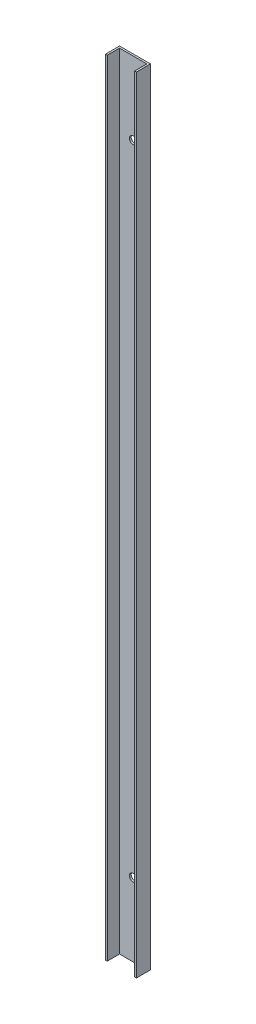
ISO-10303-21;
HEADER;
FILE_DESCRIPTION(('STEP AP214'),'2;1');
FILE_NAME('part.step','',(''),(''),'','','');
FILE_SCHEMA(('AUTOMOTIVE_DESIGN { 1 0 10303 214 1 1 1 1 }'));
ENDSEC;
DATA;
#1=APPLICATION_CONTEXT('core data for automotive mechanical design processes');
#2=APPLICATION_PROTOCOL_DEFINITION('international standard','automotive_design',2000,#1);
#3=PRODUCT_CONTEXT('',#1,'mechanical');
#4=PRODUCT('Part','Part','',(#3));
#5=PRODUCT_RELATED_PRODUCT_CATEGORY('part','',(#4));
#6=PRODUCT_DEFINITION_FORMATION('','',#4);
#7=PRODUCT_DEFINITION_CONTEXT('part definition',#1,'design');
#8=PRODUCT_DEFINITION('design','',#6,#7);
#9=PRODUCT_DEFINITION_SHAPE('','',#8);
#10=(LENGTH_UNIT() NAMED_UNIT(*) SI_UNIT(.MILLI.,.METRE.));
#11=(NAMED_UNIT(*) PLANE_ANGLE_UNIT() SI_UNIT($,.RADIAN.));
#12=(NAMED_UNIT(*) SI_UNIT($,.STERADIAN.) SOLID_ANGLE_UNIT());
#13=UNCERTAINTY_MEASURE_WITH_UNIT(LENGTH_MEASURE(1.E-05),#10,'distance_accuracy_value','');
#14=(GEOMETRIC_REPRESENTATION_CONTEXT(3) GLOBAL_UNCERTAINTY_ASSIGNED_CONTEXT((#13)) GLOBAL_UNIT_ASSIGNED_CONTEXT((#10,
#11,#12)) REPRESENTATION_CONTEXT('',''));
#15=CARTESIAN_POINT('',(0.,0.,0.));
#16=DIRECTION('',(0.,0.,1.));
#17=DIRECTION('',(1.,0.,0.));
#18=AXIS2_PLACEMENT_3D('',#15,#16,#17);
#19=CARTESIAN_POINT('',(5.05454545454545,430.,-7.7));
#20=DIRECTION('',(1.,0.,0.));
#21=DIRECTION('',(0.,0.,-1.));
#22=AXIS2_PLACEMENT_3D('',#19,#20,#21);
#23=PLANE('',#22);
#24=DIRECTION('',(0.,0.,1.));
#25=VECTOR('',#24,1.);
#26=CARTESIAN_POINT('',(5.05454545454545,0.,-7.7));
#27=LINE('',#26,#25);
#28=CARTESIAN_POINT('',(5.05454545454545,0.,-6.7));
#29=VERTEX_POINT('',#28);
#30=CARTESIAN_POINT('',(5.05454545454545,0.,0.));
#31=VERTEX_POINT('',#30);
#32=EDGE_CURVE('E130',#29,#31,#27,.T.);
#33=ORIENTED_EDGE('',*,*,#32,.T.);
#34=DIRECTION('',(0.,-1.,0.));
#35=VECTOR('',#34,1.);
#36=CARTESIAN_POINT('',(5.05454545454545,430.,0.));
#37=LINE('',#36,#35);
#38=CARTESIAN_POINT('',(5.05454545454545,430.,0.));
#39=VERTEX_POINT('',#38);
#40=EDGE_CURVE('E11',#39,#31,#37,.T.);
#41=ORIENTED_EDGE('',*,*,#40,.F.);
#42=DIRECTION('',(0.,0.,1.));
#43=VECTOR('',#42,1.);
#44=CARTESIAN_POINT('',(5.05454545454545,430.,-7.7));
#45=LINE('',#44,#43);
#46=CARTESIAN_POINT('',(5.05454545454545,430.,-6.7));
#47=VERTEX_POINT('',#46);
#48=EDGE_CURVE('E88',#47,#39,#45,.T.);
#49=ORIENTED_EDGE('',*,*,#48,.F.);
#50=DIRECTION('',(0.,-1.,0.));
#51=VECTOR('',#50,1.);
#52=CARTESIAN_POINT('',(5.05454545454545,430.,-6.7));
#53=LINE('',#52,#51);
#54=EDGE_CURVE('E129',#47,#29,#53,.T.);
#55=ORIENTED_EDGE('',*,*,#54,.T.);
#56=EDGE_LOOP('',(#33,#41,#49,#55));
#57=FACE_BOUND('',#56,.T.);
#58=ADVANCED_FACE('F33',(#57),#23,.F.);
#59=CARTESIAN_POINT('',(6.05454545454545,430.,0.));
#60=DIRECTION('',(0.,0.,1.));
#61=DIRECTION('',(1.,0.,0.));
#62=AXIS2_PLACEMENT_3D('',#59,#60,#61);
#63=PLANE('',#62);
#64=DIRECTION('',(-1.,0.,0.));
#65=VECTOR('',#64,1.);
#66=CARTESIAN_POINT('',(6.05454545454545,0.,0.));
#67=LINE('',#66,#65);
#68=CARTESIAN_POINT('',(6.05454545454545,0.,0.));
#69=VERTEX_POINT('',#68);
#70=EDGE_CURVE('E133',#69,#31,#67,.T.);
#71=ORIENTED_EDGE('',*,*,#70,.F.);
#72=DIRECTION('',(0.,-1.,0.));
#73=VECTOR('',#72,1.);
#74=CARTESIAN_POINT('',(6.05454545454545,430.,0.));
#75=LINE('',#74,#73);
#76=CARTESIAN_POINT('',(6.05454545454545,430.,0.));
#77=VERTEX_POINT('',#76);
#78=EDGE_CURVE('E41',#77,#69,#75,.T.);
#79=ORIENTED_EDGE('',*,*,#78,.F.);
#80=DIRECTION('',(-1.,0.,0.));
#81=VECTOR('',#80,1.);
#82=CARTESIAN_POINT('',(6.05454545454545,430.,0.));
#83=LINE('',#82,#81);
#84=EDGE_CURVE('E173',#77,#39,#83,.T.);
#85=ORIENTED_EDGE('',*,*,#84,.T.);
#86=ORIENTED_EDGE('',*,*,#40,.T.);
#87=EDGE_LOOP('',(#71,#79,#85,#86));
#88=FACE_BOUND('',#87,.T.);
#89=ADVANCED_FACE('F164',(#88),#63,.T.);
#90=CARTESIAN_POINT('',(6.05454545454545,430.,-7.7));
#91=DIRECTION('',(1.,0.,0.));
#92=DIRECTION('',(0.,0.,-1.));
#93=AXIS2_PLACEMENT_3D('',#90,#91,#92);
#94=PLANE('',#93);
#95=DIRECTION('',(0.,0.,1.));
#96=VECTOR('',#95,1.);
#97=CARTESIAN_POINT('',(6.05454545454545,0.,-7.7));
#98=LINE('',#97,#96);
#99=CARTESIAN_POINT('',(6.05454545454545,0.,-7.7));
#100=VERTEX_POINT('',#99);
#101=EDGE_CURVE('E137',#100,#69,#98,.T.);
#102=ORIENTED_EDGE('',*,*,#101,.F.);
#103=DIRECTION('',(0.,-1.,0.));
#104=VECTOR('',#103,1.);
#105=CARTESIAN_POINT('',(6.05454545454545,430.,-7.7));
#106=LINE('',#105,#104);
#107=CARTESIAN_POINT('',(6.05454545454545,430.,-7.7));
#108=VERTEX_POINT('',#107);
#109=EDGE_CURVE('E154',#108,#100,#106,.T.);
#110=ORIENTED_EDGE('',*,*,#109,.F.);
#111=DIRECTION('',(0.,0.,1.));
#112=VECTOR('',#111,1.);
#113=CARTESIAN_POINT('',(6.05454545454545,430.,-7.7));
#114=LINE('',#113,#112);
#115=EDGE_CURVE('E161',#108,#77,#114,.T.);
#116=ORIENTED_EDGE('',*,*,#115,.T.);
#117=ORIENTED_EDGE('',*,*,#78,.T.);
#118=EDGE_LOOP('',(#102,#110,#116,#117));
#119=FACE_BOUND('',#118,.T.);
#120=ADVANCED_FACE('F159',(#119),#94,.T.);
#121=CARTESIAN_POINT('',(-10.9454545454545,430.,-7.7));
#122=DIRECTION('',(0.,0.,-1.));
#123=DIRECTION('',(-1.,0.,0.));
#124=AXIS2_PLACEMENT_3D('',#121,#122,#123);
#125=PLANE('',#124);
#126=CARTESIAN_POINT('',(-2.44545454545446,39.9999999999999,-7.7));
#127=DIRECTION('',(0.,0.,-1.));
#128=DIRECTION('',(-1.,0.,0.));
#129=AXIS2_PLACEMENT_3D('',#126,#127,#128);
#130=CIRCLE('',#129,2.1);
#131=CARTESIAN_POINT('',(-4.54545454545446,39.9999999999999,-7.7));
#132=VERTEX_POINT('',#131);
#133=EDGE_CURVE('E183',#132,#132,#130,.T.);
#134=ORIENTED_EDGE('',*,*,#133,.F.);
#135=EDGE_LOOP('',(#134));
#136=FACE_BOUND('',#135,.T.);
#137=CARTESIAN_POINT('',(-2.44545454545455,390.,-7.7));
#138=DIRECTION('',(0.,0.,-1.));
#139=DIRECTION('',(-1.,0.,0.));
#140=AXIS2_PLACEMENT_3D('',#137,#138,#139);
#141=CIRCLE('',#140,2.1);
#142=CARTESIAN_POINT('',(-4.54545454545455,390.,-7.7));
#143=VERTEX_POINT('',#142);
#144=EDGE_CURVE('E134',#143,#143,#141,.T.);
#145=ORIENTED_EDGE('',*,*,#144,.F.);
#146=EDGE_LOOP('',(#145));
#147=FACE_BOUND('',#146,.T.);
#148=DIRECTION('',(1.,0.,0.));
#149=VECTOR('',#148,1.);
#150=CARTESIAN_POINT('',(-10.9454545454545,0.,-7.7));
#151=LINE('',#150,#149);
#152=CARTESIAN_POINT('',(-10.9454545454545,0.,-7.7));
#153=VERTEX_POINT('',#152);
#154=EDGE_CURVE('E140',#153,#100,#151,.T.);
#155=ORIENTED_EDGE('',*,*,#154,.F.);
#156=DIRECTION('',(0.,-1.,0.));
#157=VECTOR('',#156,1.);
#158=CARTESIAN_POINT('',(-10.9454545454545,430.,-7.7));
#159=LINE('',#158,#157);
#160=CARTESIAN_POINT('',(-10.9454545454545,430.,-7.7));
#161=VERTEX_POINT('',#160);
#162=EDGE_CURVE('E152',#161,#153,#159,.T.);
#163=ORIENTED_EDGE('',*,*,#162,.F.);
#164=DIRECTION('',(1.,0.,0.));
#165=VECTOR('',#164,1.);
#166=CARTESIAN_POINT('',(-10.9454545454545,430.,-7.7));
#167=LINE('',#166,#165);
#168=EDGE_CURVE('E124',#161,#108,#167,.T.);
#169=ORIENTED_EDGE('',*,*,#168,.T.);
#170=ORIENTED_EDGE('',*,*,#109,.T.);
#171=EDGE_LOOP('',(#155,#163,#169,#170));
#172=FACE_BOUND('',#171,.T.);
#173=ADVANCED_FACE('F171',(#136,#147,#172),#125,.T.);
#174=CARTESIAN_POINT('',(-10.9454545454545,430.,0.));
#175=DIRECTION('',(-1.,0.,0.));
#176=DIRECTION('',(0.,0.,1.));
#177=AXIS2_PLACEMENT_3D('',#174,#175,#176);
#178=PLANE('',#177);
#179=DIRECTION('',(0.,0.,-1.));
#180=VECTOR('',#179,1.);
#181=CARTESIAN_POINT('',(-10.9454545454545,0.,0.));
#182=LINE('',#181,#180);
#183=CARTESIAN_POINT('',(-10.9454545454545,0.,0.));
#184=VERTEX_POINT('',#183);
#185=EDGE_CURVE('E143',#184,#153,#182,.T.);
#186=ORIENTED_EDGE('',*,*,#185,.F.);
#187=DIRECTION('',(0.,-1.,0.));
#188=VECTOR('',#187,1.);
#189=CARTESIAN_POINT('',(-10.9454545454545,430.,0.));
#190=LINE('',#189,#188);
#191=CARTESIAN_POINT('',(-10.9454545454545,430.,0.));
#192=VERTEX_POINT('',#191);
#193=EDGE_CURVE('E112',#192,#184,#190,.T.);
#194=ORIENTED_EDGE('',*,*,#193,.F.);
#195=DIRECTION('',(0.,0.,-1.));
#196=VECTOR('',#195,1.);
#197=CARTESIAN_POINT('',(-10.9454545454545,430.,0.));
#198=LINE('',#197,#196);
#199=EDGE_CURVE('E122',#192,#161,#198,.T.);
#200=ORIENTED_EDGE('',*,*,#199,.T.);
#201=ORIENTED_EDGE('',*,*,#162,.T.);
#202=EDGE_LOOP('',(#186,#194,#200,#201));
#203=FACE_BOUND('',#202,.T.);
#204=ADVANCED_FACE('F222',(#203),#178,.T.);
#205=CARTESIAN_POINT('',(-9.94545454545455,430.,0.));
#206=DIRECTION('',(0.,0.,1.));
#207=DIRECTION('',(1.,0.,0.));
#208=AXIS2_PLACEMENT_3D('',#205,#206,#207);
#209=PLANE('',#208);
#210=DIRECTION('',(-1.,0.,0.));
#211=VECTOR('',#210,1.);
#212=CARTESIAN_POINT('',(-9.94545454545455,0.,0.));
#213=LINE('',#212,#211);
#214=CARTESIAN_POINT('',(-9.94545454545455,0.,0.));
#215=VERTEX_POINT('',#214);
#216=EDGE_CURVE('E111',#215,#184,#213,.T.);
#217=ORIENTED_EDGE('',*,*,#216,.F.);
#218=DIRECTION('',(0.,-1.,0.));
#219=VECTOR('',#218,1.);
#220=CARTESIAN_POINT('',(-9.94545454545455,430.,0.));
#221=LINE('',#220,#219);
#222=CARTESIAN_POINT('',(-9.94545454545455,430.,0.));
#223=VERTEX_POINT('',#222);
#224=EDGE_CURVE('E105',#223,#215,#221,.T.);
#225=ORIENTED_EDGE('',*,*,#224,.F.);
#226=DIRECTION('',(-1.,0.,0.));
#227=VECTOR('',#226,1.);
#228=CARTESIAN_POINT('',(-9.94545454545455,430.,0.));
#229=LINE('',#228,#227);
#230=EDGE_CURVE('E109',#223,#192,#229,.T.);
#231=ORIENTED_EDGE('',*,*,#230,.T.);
#232=ORIENTED_EDGE('',*,*,#193,.T.);
#233=EDGE_LOOP('',(#217,#225,#231,#232));
#234=FACE_BOUND('',#233,.T.);
#235=ADVANCED_FACE('F107',(#234),#209,.T.);
#236=CARTESIAN_POINT('',(-9.94545454545455,430.,0.));
#237=DIRECTION('',(-1.,0.,0.));
#238=DIRECTION('',(0.,0.,1.));
#239=AXIS2_PLACEMENT_3D('',#236,#237,#238);
#240=PLANE('',#239);
#241=DIRECTION('',(0.,0.,-1.));
#242=VECTOR('',#241,1.);
#243=CARTESIAN_POINT('',(-9.94545454545455,0.,0.));
#244=LINE('',#243,#242);
#245=CARTESIAN_POINT('',(-9.94545454545455,0.,-6.7));
#246=VERTEX_POINT('',#245);
#247=EDGE_CURVE('E76',#215,#246,#244,.T.);
#248=ORIENTED_EDGE('',*,*,#247,.T.);
#249=DIRECTION('',(0.,-1.,0.));
#250=VECTOR('',#249,1.);
#251=CARTESIAN_POINT('',(-9.94545454545455,430.,-6.7));
#252=LINE('',#251,#250);
#253=CARTESIAN_POINT('',(-9.94545454545455,430.,-6.7));
#254=VERTEX_POINT('',#253);
#255=EDGE_CURVE('E113',#254,#246,#252,.T.);
#256=ORIENTED_EDGE('',*,*,#255,.F.);
#257=DIRECTION('',(0.,0.,-1.));
#258=VECTOR('',#257,1.);
#259=CARTESIAN_POINT('',(-9.94545454545455,430.,0.));
#260=LINE('',#259,#258);
#261=EDGE_CURVE('E115',#223,#254,#260,.T.);
#262=ORIENTED_EDGE('',*,*,#261,.F.);
#263=ORIENTED_EDGE('',*,*,#224,.T.);
#264=EDGE_LOOP('',(#248,#256,#262,#263));
#265=FACE_BOUND('',#264,.T.);
#266=ADVANCED_FACE('F116',(#265),#240,.F.);
#267=CARTESIAN_POINT('',(-10.9454545454545,430.,-6.7));
#268=DIRECTION('',(0.,0.,-1.));
#269=DIRECTION('',(-1.,0.,0.));
#270=AXIS2_PLACEMENT_3D('',#267,#268,#269);
#271=PLANE('',#270);
#272=CARTESIAN_POINT('',(-2.44545454545446,39.9999999999999,-6.7));
#273=DIRECTION('',(0.,0.,1.));
#274=DIRECTION('',(-1.,0.,0.));
#275=AXIS2_PLACEMENT_3D('',#272,#273,#274);
#276=CIRCLE('',#275,2.1);
#277=CARTESIAN_POINT('',(-4.54545454545446,39.9999999999999,-6.7));
#278=VERTEX_POINT('',#277);
#279=EDGE_CURVE('E186',#278,#278,#276,.T.);
#280=ORIENTED_EDGE('',*,*,#279,.F.);
#281=EDGE_LOOP('',(#280));
#282=FACE_BOUND('',#281,.T.);
#283=CARTESIAN_POINT('',(-2.44545454545455,390.,-6.7));
#284=DIRECTION('',(0.,0.,1.));
#285=DIRECTION('',(1.,0.,0.));
#286=AXIS2_PLACEMENT_3D('',#283,#284,#285);
#287=CIRCLE('',#286,2.1);
#288=CARTESIAN_POINT('',(-0.345454545454551,390.,-6.7));
#289=VERTEX_POINT('',#288);
#290=EDGE_CURVE('E180',#289,#289,#287,.T.);
#291=ORIENTED_EDGE('',*,*,#290,.F.);
#292=EDGE_LOOP('',(#291));
#293=FACE_BOUND('',#292,.T.);
#294=DIRECTION('',(1.,0.,0.));
#295=VECTOR('',#294,1.);
#296=CARTESIAN_POINT('',(-10.9454545454545,0.,-6.7));
#297=LINE('',#296,#295);
#298=EDGE_CURVE('E82',#246,#29,#297,.T.);
#299=ORIENTED_EDGE('',*,*,#298,.T.);
#300=ORIENTED_EDGE('',*,*,#54,.F.);
#301=DIRECTION('',(1.,0.,0.));
#302=VECTOR('',#301,1.);
#303=CARTESIAN_POINT('',(-10.9454545454545,430.,-6.7));
#304=LINE('',#303,#302);
#305=EDGE_CURVE('E49',#254,#47,#304,.T.);
#306=ORIENTED_EDGE('',*,*,#305,.F.);
#307=ORIENTED_EDGE('',*,*,#255,.T.);
#308=EDGE_LOOP('',(#299,#300,#306,#307));
#309=FACE_BOUND('',#308,.T.);
#310=ADVANCED_FACE('F192',(#282,#293,#309),#271,.F.);
#311=CARTESIAN_POINT('',(0.,430.,0.));
#312=DIRECTION('',(0.,-1.,0.));
#313=DIRECTION('',(-1.,0.,0.));
#314=AXIS2_PLACEMENT_3D('',#311,#312,#313);
#315=PLANE('',#314);
#316=ORIENTED_EDGE('',*,*,#48,.T.);
#317=ORIENTED_EDGE('',*,*,#84,.F.);
#318=ORIENTED_EDGE('',*,*,#115,.F.);
#319=ORIENTED_EDGE('',*,*,#168,.F.);
#320=ORIENTED_EDGE('',*,*,#199,.F.);
#321=ORIENTED_EDGE('',*,*,#230,.F.);
#322=ORIENTED_EDGE('',*,*,#261,.T.);
#323=ORIENTED_EDGE('',*,*,#305,.T.);
#324=EDGE_LOOP('',(#316,#317,#318,#319,#320,#321,#322,#323));
#325=FACE_BOUND('',#324,.T.);
#326=ADVANCED_FACE('F119',(#325),#315,.F.);
#327=CARTESIAN_POINT('',(0.,0.,0.));
#328=DIRECTION('',(0.,-1.,0.));
#329=DIRECTION('',(-1.,0.,0.));
#330=AXIS2_PLACEMENT_3D('',#327,#328,#329);
#331=PLANE('',#330);
#332=ORIENTED_EDGE('',*,*,#32,.F.);
#333=ORIENTED_EDGE('',*,*,#298,.F.);
#334=ORIENTED_EDGE('',*,*,#247,.F.);
#335=ORIENTED_EDGE('',*,*,#216,.T.);
#336=ORIENTED_EDGE('',*,*,#185,.T.);
#337=ORIENTED_EDGE('',*,*,#154,.T.);
#338=ORIENTED_EDGE('',*,*,#101,.T.);
#339=ORIENTED_EDGE('',*,*,#70,.T.);
#340=EDGE_LOOP('',(#332,#333,#334,#335,#336,#337,#338,#339));
#341=FACE_BOUND('',#340,.T.);
#342=ADVANCED_FACE('F167',(#341),#331,.T.);
#343=CARTESIAN_POINT('',(-2.44545454545455,390.,-16.7));
#344=DIRECTION('',(0.,0.,1.));
#345=DIRECTION('',(1.,0.,0.));
#346=AXIS2_PLACEMENT_3D('',#343,#344,#345);
#347=CYLINDRICAL_SURFACE('',#346,2.1);
#348=ORIENTED_EDGE('',*,*,#144,.T.);
#349=EDGE_LOOP('',(#348));
#350=FACE_BOUND('',#349,.T.);
#351=ORIENTED_EDGE('',*,*,#290,.T.);
#352=EDGE_LOOP('',(#351));
#353=FACE_BOUND('',#352,.T.);
#354=ADVANCED_FACE('F198',(#350,#353),#347,.F.);
#355=CARTESIAN_POINT('',(-2.44545454545446,39.9999999999999,-16.7));
#356=DIRECTION('',(0.,0.,1.));
#357=DIRECTION('',(1.,0.,0.));
#358=AXIS2_PLACEMENT_3D('',#355,#356,#357);
#359=CYLINDRICAL_SURFACE('',#358,2.1);
#360=ORIENTED_EDGE('',*,*,#133,.T.);
#361=EDGE_LOOP('',(#360));
#362=FACE_BOUND('',#361,.T.);
#363=ORIENTED_EDGE('',*,*,#279,.T.);
#364=EDGE_LOOP('',(#363));
#365=FACE_BOUND('',#364,.T.);
#366=ADVANCED_FACE('F190',(#362,#365),#359,.F.);
#367=CLOSED_SHELL('',(#58,#89,#120,#173,#204,#235,#266,#310,#326,#342,#354,#366));
#368=MANIFOLD_SOLID_BREP('B2',#367);
#369=ADVANCED_BREP_SHAPE_REPRESENTATION('',(#18,#368),#14);
#370=SHAPE_DEFINITION_REPRESENTATION(#9,#369);
ENDSEC;
END-ISO-10303-21;
